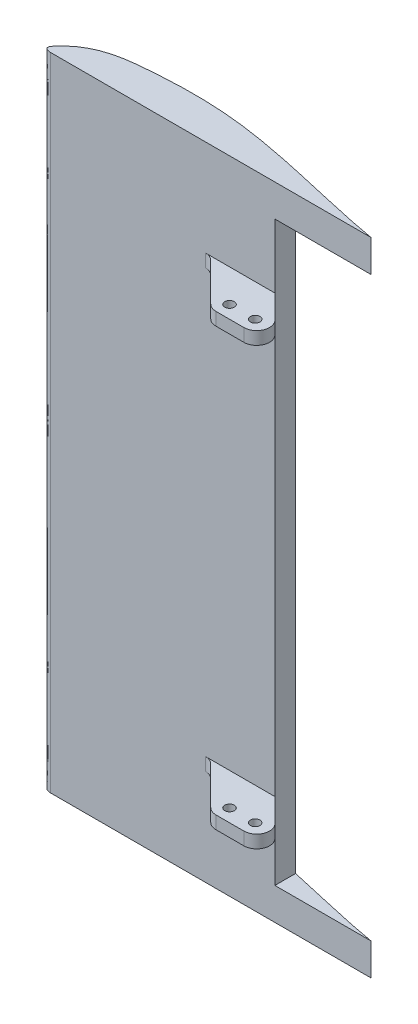
ISO-10303-21;
HEADER;
FILE_DESCRIPTION(('STEP AP214'),'2;1');
FILE_NAME('part.step','',(''),(''),'','','');
FILE_SCHEMA(('AUTOMOTIVE_DESIGN { 1 0 10303 214 1 1 1 1 }'));
ENDSEC;
DATA;
#1=APPLICATION_CONTEXT('core data for automotive mechanical design processes');
#2=APPLICATION_PROTOCOL_DEFINITION('international standard','automotive_design',2000,#1);
#3=PRODUCT_CONTEXT('',#1,'mechanical');
#4=PRODUCT('Part','Part','',(#3));
#5=PRODUCT_RELATED_PRODUCT_CATEGORY('part','',(#4));
#6=PRODUCT_DEFINITION_FORMATION('','',#4);
#7=PRODUCT_DEFINITION_CONTEXT('part definition',#1,'design');
#8=PRODUCT_DEFINITION('design','',#6,#7);
#9=PRODUCT_DEFINITION_SHAPE('','',#8);
#10=(LENGTH_UNIT() NAMED_UNIT(*) SI_UNIT(.MILLI.,.METRE.));
#11=(NAMED_UNIT(*) PLANE_ANGLE_UNIT() SI_UNIT($,.RADIAN.));
#12=(NAMED_UNIT(*) SI_UNIT($,.STERADIAN.) SOLID_ANGLE_UNIT());
#13=UNCERTAINTY_MEASURE_WITH_UNIT(LENGTH_MEASURE(1.E-05),#10,'distance_accuracy_value','');
#14=(GEOMETRIC_REPRESENTATION_CONTEXT(3) GLOBAL_UNCERTAINTY_ASSIGNED_CONTEXT((#13)) GLOBAL_UNIT_ASSIGNED_CONTEXT((#10,
#11,#12)) REPRESENTATION_CONTEXT('',''));
#15=CARTESIAN_POINT('',(0.,0.,0.));
#16=DIRECTION('',(0.,0.,1.));
#17=DIRECTION('',(1.,0.,0.));
#18=AXIS2_PLACEMENT_3D('',#15,#16,#17);
#19=CARTESIAN_POINT('',(-23.8351605851665,100.,0.));
#20=DIRECTION('',(0.,0.,-1.));
#21=DIRECTION('',(-1.,0.,0.));
#22=AXIS2_PLACEMENT_3D('',#19,#20,#21);
#23=PLANE('',#22);
#24=DIRECTION('',(-1.,0.,0.));
#25=VECTOR('',#24,1.);
#26=CARTESIAN_POINT('',(11.1648394148335,83.,0.));
#27=LINE('',#26,#25);
#28=CARTESIAN_POINT('',(11.1648394148335,83.,0.));
#29=VERTEX_POINT('',#28);
#30=CARTESIAN_POINT('',(0.336412290087355,83.,0.));
#31=VERTEX_POINT('',#30);
#32=EDGE_CURVE('E211',#29,#31,#27,.T.);
#33=ORIENTED_EDGE('',*,*,#32,.T.);
#34=DIRECTION('',(0.,-1.,0.));
#35=VECTOR('',#34,1.);
#36=CARTESIAN_POINT('',(0.336412290087355,85.,0.));
#37=LINE('',#36,#35);
#38=CARTESIAN_POINT('',(0.336412290087355,85.,0.));
#39=VERTEX_POINT('',#38);
#40=EDGE_CURVE('E586',#31,#39,#37,.F.);
#41=ORIENTED_EDGE('',*,*,#40,.T.);
#42=DIRECTION('',(-1.,0.,0.));
#43=VECTOR('',#42,1.);
#44=CARTESIAN_POINT('',(11.1648394148335,85.,0.));
#45=LINE('',#44,#43);
#46=CARTESIAN_POINT('',(11.1648394148335,85.,0.));
#47=VERTEX_POINT('',#46);
#48=EDGE_CURVE('E209',#47,#39,#45,.T.);
#49=ORIENTED_EDGE('',*,*,#48,.F.);
#50=DIRECTION('',(0.,1.,0.));
#51=VECTOR('',#50,1.);
#52=CARTESIAN_POINT('',(11.1648394148335,100.,0.));
#53=LINE('',#52,#51);
#54=CARTESIAN_POINT('',(11.1648394148335,95.,0.));
#55=VERTEX_POINT('',#54);
#56=EDGE_CURVE('E199',#47,#55,#53,.T.);
#57=ORIENTED_EDGE('',*,*,#56,.T.);
#58=DIRECTION('',(1.,0.,0.));
#59=VECTOR('',#58,1.);
#60=CARTESIAN_POINT('',(-23.8351605851665,95.,0.));
#61=LINE('',#60,#59);
#62=CARTESIAN_POINT('',(26.1648394148335,95.,0.));
#63=VERTEX_POINT('',#62);
#64=EDGE_CURVE('E243',#55,#63,#61,.T.);
#65=ORIENTED_EDGE('',*,*,#64,.T.);
#66=DIRECTION('',(0.,-1.,0.));
#67=VECTOR('',#66,1.);
#68=CARTESIAN_POINT('',(26.1648394148335,100.,0.));
#69=LINE('',#68,#67);
#70=CARTESIAN_POINT('',(26.1648394148335,100.,0.));
#71=VERTEX_POINT('',#70);
#72=EDGE_CURVE('E522',#71,#63,#69,.T.);
#73=ORIENTED_EDGE('',*,*,#72,.F.);
#74=DIRECTION('',(1.,0.,0.));
#75=VECTOR('',#74,1.);
#76=CARTESIAN_POINT('',(-23.8351605851665,100.,0.));
#77=LINE('',#76,#75);
#78=CARTESIAN_POINT('',(-23.8351605851665,100.,0.));
#79=VERTEX_POINT('',#78);
#80=EDGE_CURVE('E258',#79,#71,#77,.T.);
#81=ORIENTED_EDGE('',*,*,#80,.F.);
#82=DIRECTION('',(0.,-1.,0.));
#83=VECTOR('',#82,1.);
#84=CARTESIAN_POINT('',(-23.8351605851665,100.,0.));
#85=LINE('',#84,#83);
#86=CARTESIAN_POINT('',(-23.8351605851665,0.,0.));
#87=VERTEX_POINT('',#86);
#88=EDGE_CURVE('E525',#79,#87,#85,.T.);
#89=ORIENTED_EDGE('',*,*,#88,.T.);
#90=DIRECTION('',(1.,0.,0.));
#91=VECTOR('',#90,1.);
#92=CARTESIAN_POINT('',(-23.8351605851665,0.,0.));
#93=LINE('',#92,#91);
#94=CARTESIAN_POINT('',(26.1648394148335,0.,0.));
#95=VERTEX_POINT('',#94);
#96=EDGE_CURVE('E507',#87,#95,#93,.T.);
#97=ORIENTED_EDGE('',*,*,#96,.T.);
#98=CARTESIAN_POINT('',(26.1648394148335,5.,0.));
#99=VERTEX_POINT('',#98);
#100=EDGE_CURVE('E521',#99,#95,#69,.T.);
#101=ORIENTED_EDGE('',*,*,#100,.F.);
#102=DIRECTION('',(-1.,0.,0.));
#103=VECTOR('',#102,1.);
#104=CARTESIAN_POINT('',(-23.8351605851665,5.,0.));
#105=LINE('',#104,#103);
#106=CARTESIAN_POINT('',(11.1648394148335,5.,0.));
#107=VERTEX_POINT('',#106);
#108=EDGE_CURVE('E248',#99,#107,#105,.T.);
#109=ORIENTED_EDGE('',*,*,#108,.T.);
#110=CARTESIAN_POINT('',(11.1648394148335,15.,0.));
#111=VERTEX_POINT('',#110);
#112=EDGE_CURVE('E198',#107,#111,#53,.T.);
#113=ORIENTED_EDGE('',*,*,#112,.T.);
#114=DIRECTION('',(-1.,0.,0.));
#115=VECTOR('',#114,1.);
#116=CARTESIAN_POINT('',(11.1648394148335,15.,0.));
#117=LINE('',#116,#115);
#118=CARTESIAN_POINT('',(0.336412290087355,15.,0.));
#119=VERTEX_POINT('',#118);
#120=EDGE_CURVE('E204',#111,#119,#117,.T.);
#121=ORIENTED_EDGE('',*,*,#120,.T.);
#122=DIRECTION('',(0.,1.,0.));
#123=VECTOR('',#122,1.);
#124=CARTESIAN_POINT('',(0.336412290087355,100.,0.));
#125=LINE('',#124,#123);
#126=CARTESIAN_POINT('',(0.336412290087355,17.,0.));
#127=VERTEX_POINT('',#126);
#128=EDGE_CURVE('E203',#119,#127,#125,.T.);
#129=ORIENTED_EDGE('',*,*,#128,.T.);
#130=DIRECTION('',(-1.,0.,0.));
#131=VECTOR('',#130,1.);
#132=CARTESIAN_POINT('',(11.1648394148335,17.,0.));
#133=LINE('',#132,#131);
#134=CARTESIAN_POINT('',(11.1648394148335,17.,0.));
#135=VERTEX_POINT('',#134);
#136=EDGE_CURVE('E176',#135,#127,#133,.T.);
#137=ORIENTED_EDGE('',*,*,#136,.F.);
#138=EDGE_CURVE('E188',#135,#29,#53,.T.);
#139=ORIENTED_EDGE('',*,*,#138,.T.);
#140=EDGE_LOOP('',(#33,#41,#49,#57,#65,#73,#81,#89,#97,#101,#109,#113,#121,#129,#137,#139));
#141=FACE_BOUND('',#140,.T.);
#142=ADVANCED_FACE('F33',(#141),#23,.F.);
#143=CARTESIAN_POINT('',(-24.2675788953221,100.,-1.25622054621105));
#144=CARTESIAN_POINT('',(-25.3670812913603,100.,-0.124338634705401));
#145=CARTESIAN_POINT('',(-23.8351605851665,100.,0.));
#146=B_SPLINE_CURVE_WITH_KNOTS('',2,(#143,#144,#145),.UNSPECIFIED.,.F.,.F.,(3,3),(0.,1.),.UNSPECIFIED.);
#147=DIRECTION('',(0.,-1.,0.));
#148=VECTOR('',#147,1.);
#149=SURFACE_OF_LINEAR_EXTRUSION('',#146,#148);
#150=CARTESIAN_POINT('',(-24.2675788953221,0.,-1.25622054621105));
#151=CARTESIAN_POINT('',(-25.3670812913603,0.,-0.124338634705401));
#152=CARTESIAN_POINT('',(-23.8351605851665,0.,0.));
#153=B_SPLINE_CURVE_WITH_KNOTS('',2,(#150,#151,#152),.UNSPECIFIED.,.F.,.F.,(3,3),(0.,1.),.UNSPECIFIED.);
#154=CARTESIAN_POINT('',(-24.2675788953221,0.,-1.25622054621105));
#155=VERTEX_POINT('',#154);
#156=EDGE_CURVE('E251',#155,#87,#153,.T.);
#157=ORIENTED_EDGE('',*,*,#156,.T.);
#158=ORIENTED_EDGE('',*,*,#88,.F.);
#159=CARTESIAN_POINT('',(-24.2675788953221,100.,-1.25622054621105));
#160=VERTEX_POINT('',#159);
#161=EDGE_CURVE('E252',#160,#79,#146,.T.);
#162=ORIENTED_EDGE('',*,*,#161,.F.);
#163=DIRECTION('',(0.,-1.,0.));
#164=VECTOR('',#163,1.);
#165=CARTESIAN_POINT('',(-24.2675788953221,100.,-1.25622054621105));
#166=LINE('',#165,#164);
#167=EDGE_CURVE('E499',#160,#155,#166,.T.);
#168=ORIENTED_EDGE('',*,*,#167,.T.);
#169=EDGE_LOOP('',(#157,#158,#162,#168));
#170=FACE_BOUND('',#169,.T.);
#171=ADVANCED_FACE('F265',(#170),#149,.F.);
#172=CARTESIAN_POINT('',(26.1648394148335,100.,0.));
#173=CARTESIAN_POINT('',(19.211918985571,100.,-1.16258018784965));
#174=CARTESIAN_POINT('',(4.13271292978012,100.,-5.52501275167282));
#175=CARTESIAN_POINT('',(-8.85012049649564,100.,-5.77485183788265));
#176=CARTESIAN_POINT('',(-18.7383931036189,100.,-4.79326831168846));
#177=CARTESIAN_POINT('',(-22.278212261763,100.,-3.55358612755049));
#178=CARTESIAN_POINT('',(-24.2675788953221,100.,-1.25622054621105));
#179=B_SPLINE_CURVE_WITH_KNOTS('',3,(#172,#173,#174,#175,#176,#177,#178),.UNSPECIFIED.,.F.,.F.,
(4,1,1,1,4),(0.0219972250878111,0.49085189361201,0.815811168310364,0.866725978949163,1.),.UNSPECIFIED.);
#180=DIRECTION('',(0.,-1.,0.));
#181=VECTOR('',#180,1.);
#182=SURFACE_OF_LINEAR_EXTRUSION('',#179,#181);
#183=DIRECTION('',(0.,-1.,0.));
#184=VECTOR('',#183,1.);
#185=CARTESIAN_POINT('',(11.1648394148335,100.,-3.22712026169733));
#186=LINE('',#185,#184);
#187=CARTESIAN_POINT('',(11.1648394148346,95.,-3.22712026169709));
#188=VERTEX_POINT('',#187);
#189=CARTESIAN_POINT('',(11.1648394148335,5.,-3.22712026169733));
#190=VERTEX_POINT('',#189);
#191=EDGE_CURVE('E533',#188,#190,#186,.T.);
#192=ORIENTED_EDGE('',*,*,#191,.T.);
#193=CARTESIAN_POINT('',(26.1648394148335,5.00000000000002,0.));
#194=CARTESIAN_POINT('',(19.211918985571,5.00000000000002,-1.16258018784965));
#195=CARTESIAN_POINT('',(4.13271292978012,5.00000000000002,-5.52501275167282));
#196=CARTESIAN_POINT('',(-8.85012049649564,5.00000000000002,-5.77485183788265));
#197=CARTESIAN_POINT('',(-18.7383931036189,5.00000000000002,-4.79326831168846));
#198=CARTESIAN_POINT('',(-22.278212261763,5.00000000000002,-3.55358612755049));
#199=CARTESIAN_POINT('',(-24.2675788953221,5.00000000000002,-1.25622054621105));
#200=B_SPLINE_CURVE_WITH_KNOTS('',3,(#193,#194,#195,#196,#197,#198,#199),.UNSPECIFIED.,.F.,.F.,
(4,1,1,1,4),(0.0219972250878111,0.49085189361201,0.815811168310364,0.866725978949163,1.),.UNSPECIFIED.);
#201=EDGE_CURVE('E539',#190,#99,#200,.F.);
#202=ORIENTED_EDGE('',*,*,#201,.T.);
#203=ORIENTED_EDGE('',*,*,#100,.T.);
#204=CARTESIAN_POINT('',(26.1648394148335,0.,0.));
#205=CARTESIAN_POINT('',(19.211918985571,0.,-1.16258018784965));
#206=CARTESIAN_POINT('',(4.13271292978012,0.,-5.52501275167282));
#207=CARTESIAN_POINT('',(-8.85012049649564,0.,-5.77485183788265));
#208=CARTESIAN_POINT('',(-18.7383931036189,0.,-4.79326831168846));
#209=CARTESIAN_POINT('',(-22.278212261763,0.,-3.55358612755049));
#210=CARTESIAN_POINT('',(-24.2675788953221,0.,-1.25622054621105));
#211=B_SPLINE_CURVE_WITH_KNOTS('',3,(#204,#205,#206,#207,#208,#209,#210),.UNSPECIFIED.,.F.,.F.,
(4,1,1,1,4),(0.0219972250878111,0.49085189361201,0.815811168310364,0.866725978949163,1.),.UNSPECIFIED.);
#212=EDGE_CURVE('E259',#95,#155,#211,.T.);
#213=ORIENTED_EDGE('',*,*,#212,.T.);
#214=ORIENTED_EDGE('',*,*,#167,.F.);
#215=EDGE_CURVE('E494',#71,#160,#179,.T.);
#216=ORIENTED_EDGE('',*,*,#215,.F.);
#217=ORIENTED_EDGE('',*,*,#72,.T.);
#218=CARTESIAN_POINT('',(26.1648394148335,95.,0.));
#219=CARTESIAN_POINT('',(19.211918985571,95.,-1.16258018784965));
#220=CARTESIAN_POINT('',(4.13271292978012,95.,-5.52501275167282));
#221=CARTESIAN_POINT('',(-8.85012049649564,95.,-5.77485183788265));
#222=CARTESIAN_POINT('',(-18.7383931036189,95.,-4.79326831168846));
#223=CARTESIAN_POINT('',(-22.278212261763,95.,-3.55358612755049));
#224=CARTESIAN_POINT('',(-24.2675788953221,95.,-1.25622054621105));
#225=B_SPLINE_CURVE_WITH_KNOTS('',3,(#218,#219,#220,#221,#222,#223,#224),.UNSPECIFIED.,.F.,.F.,
(4,1,1,1,4),(0.0219972250878111,0.49085189361201,0.815811168310364,0.866725978949163,1.),.UNSPECIFIED.);
#226=EDGE_CURVE('E528',#63,#188,#225,.T.);
#227=ORIENTED_EDGE('',*,*,#226,.T.);
#228=EDGE_LOOP('',(#192,#202,#203,#213,#214,#216,#217,#227));
#229=FACE_BOUND('',#228,.T.);
#230=ADVANCED_FACE('F269',(#229),#182,.F.);
#231=CARTESIAN_POINT('',(-24.7092255158023,100.,-0.376224453905462));
#232=DIRECTION('',(0.,-1.,0.));
#233=DIRECTION('',(0.,0.,-1.));
#234=AXIS2_PLACEMENT_3D('',#231,#232,#233);
#235=PLANE('',#234);
#236=ORIENTED_EDGE('',*,*,#161,.T.);
#237=ORIENTED_EDGE('',*,*,#80,.T.);
#238=ORIENTED_EDGE('',*,*,#215,.T.);
#239=EDGE_LOOP('',(#236,#237,#238));
#240=FACE_BOUND('',#239,.T.);
#241=ADVANCED_FACE('F313',(#240),#235,.F.);
#242=CARTESIAN_POINT('',(-24.7092255158023,0.,-0.376224453905462));
#243=DIRECTION('',(0.,-1.,0.));
#244=DIRECTION('',(0.,0.,-1.));
#245=AXIS2_PLACEMENT_3D('',#242,#243,#244);
#246=PLANE('',#245);
#247=ORIENTED_EDGE('',*,*,#156,.F.);
#248=ORIENTED_EDGE('',*,*,#212,.F.);
#249=ORIENTED_EDGE('',*,*,#96,.F.);
#250=EDGE_LOOP('',(#247,#248,#249));
#251=FACE_BOUND('',#250,.T.);
#252=ADVANCED_FACE('F321',(#251),#246,.T.);
#253=CARTESIAN_POINT('',(26.1648394148335,5.,-90.));
#254=DIRECTION('',(0.,-1.,0.));
#255=DIRECTION('',(0.,0.,-1.));
#256=AXIS2_PLACEMENT_3D('',#253,#254,#255);
#257=PLANE('',#256);
#258=ORIENTED_EDGE('',*,*,#201,.F.);
#259=DIRECTION('',(0.,0.,1.));
#260=VECTOR('',#259,1.);
#261=CARTESIAN_POINT('',(11.1648394148335,5.,-90.));
#262=LINE('',#261,#260);
#263=EDGE_CURVE('E240',#190,#107,#262,.T.);
#264=ORIENTED_EDGE('',*,*,#263,.T.);
#265=ORIENTED_EDGE('',*,*,#108,.F.);
#266=EDGE_LOOP('',(#258,#264,#265));
#267=FACE_BOUND('',#266,.T.);
#268=ADVANCED_FACE('F328',(#267),#257,.F.);
#269=CARTESIAN_POINT('',(11.1648394148335,95.,-90.));
#270=DIRECTION('',(-1.,0.,0.));
#271=DIRECTION('',(0.,-1.,0.));
#272=AXIS2_PLACEMENT_3D('',#269,#270,#271);
#273=PLANE('',#272);
#274=ORIENTED_EDGE('',*,*,#263,.F.);
#275=ORIENTED_EDGE('',*,*,#191,.F.);
#276=DIRECTION('',(0.,0.,1.));
#277=VECTOR('',#276,1.);
#278=CARTESIAN_POINT('',(11.1648394148335,95.,-90.));
#279=LINE('',#278,#277);
#280=EDGE_CURVE('E239',#188,#55,#279,.T.);
#281=ORIENTED_EDGE('',*,*,#280,.T.);
#282=ORIENTED_EDGE('',*,*,#56,.F.);
#283=DIRECTION('',(0.,-1.,0.));
#284=VECTOR('',#283,1.);
#285=CARTESIAN_POINT('',(11.1648394148335,85.,0.));
#286=LINE('',#285,#284);
#287=EDGE_CURVE('E195',#47,#29,#286,.T.);
#288=ORIENTED_EDGE('',*,*,#287,.T.);
#289=ORIENTED_EDGE('',*,*,#138,.F.);
#290=DIRECTION('',(0.,1.,0.));
#291=VECTOR('',#290,1.);
#292=CARTESIAN_POINT('',(11.1648394148335,15.,0.));
#293=LINE('',#292,#291);
#294=EDGE_CURVE('E191',#111,#135,#293,.T.);
#295=ORIENTED_EDGE('',*,*,#294,.F.);
#296=ORIENTED_EDGE('',*,*,#112,.F.);
#297=EDGE_LOOP('',(#274,#275,#281,#282,#288,#289,#295,#296));
#298=FACE_BOUND('',#297,.T.);
#299=ADVANCED_FACE('F190',(#298),#273,.F.);
#300=CARTESIAN_POINT('',(26.1648394148335,95.,-90.));
#301=DIRECTION('',(0.,1.,0.));
#302=DIRECTION('',(0.,0.,1.));
#303=AXIS2_PLACEMENT_3D('',#300,#301,#302);
#304=PLANE('',#303);
#305=ORIENTED_EDGE('',*,*,#280,.F.);
#306=ORIENTED_EDGE('',*,*,#226,.F.);
#307=ORIENTED_EDGE('',*,*,#64,.F.);
#308=EDGE_LOOP('',(#305,#306,#307));
#309=FACE_BOUND('',#308,.T.);
#310=ADVANCED_FACE('F343',(#309),#304,.F.);
#311=CARTESIAN_POINT('',(18.2359072266991,85.,7.07106781186544));
#312=DIRECTION('',(0.,-1.,0.));
#313=DIRECTION('',(0.,0.,-1.));
#314=AXIS2_PLACEMENT_3D('',#311,#312,#313);
#315=PLANE('',#314);
#316=CARTESIAN_POINT('',(13.1648394148335,85.,5.07106781186544));
#317=DIRECTION('',(0.,1.,0.));
#318=DIRECTION('',(0.,0.,1.));
#319=AXIS2_PLACEMENT_3D('',#316,#317,#318);
#320=CIRCLE('',#319,0.75);
#321=CARTESIAN_POINT('',(13.1648394148335,85.,5.82106781186544));
#322=VERTEX_POINT('',#321);
#323=EDGE_CURVE('E656',#322,#322,#320,.T.);
#324=ORIENTED_EDGE('',*,*,#323,.F.);
#325=EDGE_LOOP('',(#324));
#326=FACE_BOUND('',#325,.T.);
#327=CARTESIAN_POINT('',(9.16483941483353,85.,5.07106781186544));
#328=DIRECTION('',(0.,1.,0.));
#329=DIRECTION('',(0.,0.,1.));
#330=AXIS2_PLACEMENT_3D('',#327,#328,#329);
#331=CIRCLE('',#330,0.75);
#332=CARTESIAN_POINT('',(9.16483941483353,85.,5.82106781186544));
#333=VERTEX_POINT('',#332);
#334=EDGE_CURVE('E598',#333,#333,#331,.T.);
#335=ORIENTED_EDGE('',*,*,#334,.F.);
#336=EDGE_LOOP('',(#335));
#337=FACE_BOUND('',#336,.T.);
#338=DIRECTION('',(-1.,0.,0.));
#339=VECTOR('',#338,1.);
#340=CARTESIAN_POINT('',(18.2359072266991,85.,7.07106781186544));
#341=LINE('',#340,#339);
#342=CARTESIAN_POINT('',(13.4074801019528,85.,7.07106781186544));
#343=VERTEX_POINT('',#342);
#344=CARTESIAN_POINT('',(9.06433435144524,85.,7.07106781186544));
#345=VERTEX_POINT('',#344);
#346=EDGE_CURVE('E221',#343,#345,#341,.T.);
#347=ORIENTED_EDGE('',*,*,#346,.F.);
#348=CARTESIAN_POINT('',(13.4074801019528,85.,5.07106781186544));
#349=DIRECTION('',(0.,-1.,0.));
#350=DIRECTION('',(0.,0.,-1.));
#351=AXIS2_PLACEMENT_3D('',#348,#349,#350);
#352=CIRCLE('',#351,2.);
#353=CARTESIAN_POINT('',(14.8216936643259,85.,3.65685424949234));
#354=VERTEX_POINT('',#353);
#355=EDGE_CURVE('E561',#343,#354,#352,.F.);
#356=ORIENTED_EDGE('',*,*,#355,.T.);
#357=DIRECTION('',(-0.707106781186551,0.,-0.707106781186544));
#358=VECTOR('',#357,1.);
#359=CARTESIAN_POINT('',(18.2359072266991,85.,7.07106781186544));
#360=LINE('',#359,#358);
#361=EDGE_CURVE('E226',#354,#47,#360,.T.);
#362=ORIENTED_EDGE('',*,*,#361,.T.);
#363=ORIENTED_EDGE('',*,*,#48,.T.);
#364=CARTESIAN_POINT('',(0.336412290087355,85.,2.));
#365=DIRECTION('',(0.,-1.,0.));
#366=DIRECTION('',(0.,0.,-1.));
#367=AXIS2_PLACEMENT_3D('',#364,#365,#366);
#368=CIRCLE('',#367,2.);
#369=CARTESIAN_POINT('',(1.75062585246044,85.,0.585786437626895));
#370=VERTEX_POINT('',#369);
#371=EDGE_CURVE('E593',#39,#370,#368,.T.);
#372=ORIENTED_EDGE('',*,*,#371,.T.);
#373=DIRECTION('',(-0.707106781186551,0.,-0.707106781186544));
#374=VECTOR('',#373,1.);
#375=CARTESIAN_POINT('',(8.23590722669905,85.,7.07106781186544));
#376=LINE('',#375,#374);
#377=CARTESIAN_POINT('',(7.65012078907215,85.,6.48528137423854));
#378=VERTEX_POINT('',#377);
#379=EDGE_CURVE('E236',#378,#370,#376,.T.);
#380=ORIENTED_EDGE('',*,*,#379,.F.);
#381=CARTESIAN_POINT('',(9.06433435144524,85.,5.07106781186544));
#382=DIRECTION('',(0.,-1.,0.));
#383=DIRECTION('',(0.,0.,-1.));
#384=AXIS2_PLACEMENT_3D('',#381,#382,#383);
#385=CIRCLE('',#384,2.);
#386=EDGE_CURVE('E559',#378,#345,#385,.F.);
#387=ORIENTED_EDGE('',*,*,#386,.T.);
#388=EDGE_LOOP('',(#347,#356,#362,#363,#372,#380,#387));
#389=FACE_BOUND('',#388,.T.);
#390=ADVANCED_FACE('F350',(#326,#337,#389),#315,.F.);
#391=CARTESIAN_POINT('',(8.23590722669905,85.,7.07106781186544));
#392=DIRECTION('',(0.707106781186544,0.,-0.707106781186551));
#393=DIRECTION('',(-0.707106781186551,0.,-0.707106781186544));
#394=AXIS2_PLACEMENT_3D('',#391,#392,#393);
#395=PLANE('',#394);
#396=ORIENTED_EDGE('',*,*,#379,.T.);
#397=DIRECTION('',(0.,-1.,0.));
#398=VECTOR('',#397,1.);
#399=CARTESIAN_POINT('',(1.75062585246044,83.,0.585786437626897));
#400=LINE('',#399,#398);
#401=CARTESIAN_POINT('',(1.75062585246044,83.,0.585786437626895));
#402=VERTEX_POINT('',#401);
#403=EDGE_CURVE('E582',#370,#402,#400,.T.);
#404=ORIENTED_EDGE('',*,*,#403,.T.);
#405=DIRECTION('',(-0.707106781186551,0.,-0.707106781186544));
#406=VECTOR('',#405,1.);
#407=CARTESIAN_POINT('',(8.23590722669905,83.,7.07106781186544));
#408=LINE('',#407,#406);
#409=CARTESIAN_POINT('',(7.65012078907215,83.,6.48528137423854));
#410=VERTEX_POINT('',#409);
#411=EDGE_CURVE('E233',#410,#402,#408,.T.);
#412=ORIENTED_EDGE('',*,*,#411,.F.);
#413=DIRECTION('',(0.,-1.,0.));
#414=VECTOR('',#413,1.);
#415=CARTESIAN_POINT('',(7.65012078907215,85.,6.48528137423854));
#416=LINE('',#415,#414);
#417=EDGE_CURVE('E563',#410,#378,#416,.F.);
#418=ORIENTED_EDGE('',*,*,#417,.T.);
#419=EDGE_LOOP('',(#396,#404,#412,#418));
#420=FACE_BOUND('',#419,.T.);
#421=ADVANCED_FACE('F358',(#420),#395,.F.);
#422=CARTESIAN_POINT('',(18.2359072266991,83.,7.07106781186544));
#423=DIRECTION('',(0.,-1.,0.));
#424=DIRECTION('',(0.,0.,-1.));
#425=AXIS2_PLACEMENT_3D('',#422,#423,#424);
#426=PLANE('',#425);
#427=CARTESIAN_POINT('',(13.1648394148335,83.,5.07106781186544));
#428=DIRECTION('',(0.,-1.,0.));
#429=DIRECTION('',(0.,0.,-1.));
#430=AXIS2_PLACEMENT_3D('',#427,#428,#429);
#431=CIRCLE('',#430,0.75);
#432=CARTESIAN_POINT('',(13.1648394148335,83.,4.32106781186544));
#433=VERTEX_POINT('',#432);
#434=EDGE_CURVE('E603',#433,#433,#431,.T.);
#435=ORIENTED_EDGE('',*,*,#434,.F.);
#436=EDGE_LOOP('',(#435));
#437=FACE_BOUND('',#436,.T.);
#438=CARTESIAN_POINT('',(9.16483941483353,83.,5.07106781186544));
#439=DIRECTION('',(0.,-1.,0.));
#440=DIRECTION('',(0.,0.,-1.));
#441=AXIS2_PLACEMENT_3D('',#438,#439,#440);
#442=CIRCLE('',#441,0.75);
#443=CARTESIAN_POINT('',(9.16483941483353,83.,4.32106781186544));
#444=VERTEX_POINT('',#443);
#445=EDGE_CURVE('E182',#444,#444,#442,.T.);
#446=ORIENTED_EDGE('',*,*,#445,.F.);
#447=EDGE_LOOP('',(#446));
#448=FACE_BOUND('',#447,.T.);
#449=DIRECTION('',(-0.707106781186551,0.,-0.707106781186544));
#450=VECTOR('',#449,1.);
#451=CARTESIAN_POINT('',(18.2359072266991,83.,7.07106781186544));
#452=LINE('',#451,#450);
#453=CARTESIAN_POINT('',(14.8216936643259,83.,3.65685424949234));
#454=VERTEX_POINT('',#453);
#455=EDGE_CURVE('E231',#454,#29,#452,.T.);
#456=ORIENTED_EDGE('',*,*,#455,.F.);
#457=CARTESIAN_POINT('',(13.4074801019528,83.,5.07106781186544));
#458=DIRECTION('',(0.,-1.,0.));
#459=DIRECTION('',(0.,0.,-1.));
#460=AXIS2_PLACEMENT_3D('',#457,#458,#459);
#461=CIRCLE('',#460,2.);
#462=CARTESIAN_POINT('',(13.4074801019528,83.,7.07106781186544));
#463=VERTEX_POINT('',#462);
#464=EDGE_CURVE('E552',#454,#463,#461,.T.);
#465=ORIENTED_EDGE('',*,*,#464,.T.);
#466=DIRECTION('',(-1.,0.,0.));
#467=VECTOR('',#466,1.);
#468=CARTESIAN_POINT('',(18.2359072266991,83.,7.07106781186544));
#469=LINE('',#468,#467);
#470=CARTESIAN_POINT('',(9.06433435144524,83.,7.07106781186544));
#471=VERTEX_POINT('',#470);
#472=EDGE_CURVE('E224',#463,#471,#469,.T.);
#473=ORIENTED_EDGE('',*,*,#472,.T.);
#474=CARTESIAN_POINT('',(9.06433435144524,83.,5.07106781186544));
#475=DIRECTION('',(0.,-1.,0.));
#476=DIRECTION('',(0.,0.,-1.));
#477=AXIS2_PLACEMENT_3D('',#474,#475,#476);
#478=CIRCLE('',#477,2.);
#479=EDGE_CURVE('E550',#471,#410,#478,.T.);
#480=ORIENTED_EDGE('',*,*,#479,.T.);
#481=ORIENTED_EDGE('',*,*,#411,.T.);
#482=CARTESIAN_POINT('',(0.336412290087355,83.,2.));
#483=DIRECTION('',(0.,-1.,0.));
#484=DIRECTION('',(0.,0.,-1.));
#485=AXIS2_PLACEMENT_3D('',#482,#483,#484);
#486=CIRCLE('',#485,2.);
#487=EDGE_CURVE('E590',#402,#31,#486,.F.);
#488=ORIENTED_EDGE('',*,*,#487,.T.);
#489=ORIENTED_EDGE('',*,*,#32,.F.);
#490=EDGE_LOOP('',(#456,#465,#473,#480,#481,#488,#489));
#491=FACE_BOUND('',#490,.T.);
#492=ADVANCED_FACE('F367',(#437,#448,#491),#426,.T.);
#493=CARTESIAN_POINT('',(18.2359072266991,85.,7.07106781186544));
#494=DIRECTION('',(0.707106781186544,0.,-0.707106781186551));
#495=DIRECTION('',(-0.707106781186551,0.,-0.707106781186544));
#496=AXIS2_PLACEMENT_3D('',#493,#494,#495);
#497=PLANE('',#496);
#498=ORIENTED_EDGE('',*,*,#361,.F.);
#499=DIRECTION('',(0.,-1.,0.));
#500=VECTOR('',#499,1.);
#501=CARTESIAN_POINT('',(14.8216936643259,85.,3.65685424949234));
#502=LINE('',#501,#500);
#503=EDGE_CURVE('E544',#354,#454,#502,.T.);
#504=ORIENTED_EDGE('',*,*,#503,.T.);
#505=ORIENTED_EDGE('',*,*,#455,.T.);
#506=ORIENTED_EDGE('',*,*,#287,.F.);
#507=EDGE_LOOP('',(#498,#504,#505,#506));
#508=FACE_BOUND('',#507,.T.);
#509=ADVANCED_FACE('F375',(#508),#497,.T.);
#510=CARTESIAN_POINT('',(7.07106781186551,0.,7.07106781186544));
#511=DIRECTION('',(0.,0.,1.));
#512=DIRECTION('',(1.,0.,0.));
#513=AXIS2_PLACEMENT_3D('',#510,#511,#512);
#514=PLANE('',#513);
#515=ORIENTED_EDGE('',*,*,#472,.F.);
#516=DIRECTION('',(0.,-1.,0.));
#517=VECTOR('',#516,1.);
#518=CARTESIAN_POINT('',(13.4074801019528,0.,7.07106781186544));
#519=LINE('',#518,#517);
#520=EDGE_CURVE('E557',#463,#343,#519,.F.);
#521=ORIENTED_EDGE('',*,*,#520,.T.);
#522=ORIENTED_EDGE('',*,*,#346,.T.);
#523=DIRECTION('',(0.,-1.,0.));
#524=VECTOR('',#523,1.);
#525=CARTESIAN_POINT('',(9.06433435144524,83.,7.07106781186544));
#526=LINE('',#525,#524);
#527=EDGE_CURVE('E554',#345,#471,#526,.T.);
#528=ORIENTED_EDGE('',*,*,#527,.T.);
#529=EDGE_LOOP('',(#515,#521,#522,#528));
#530=FACE_BOUND('',#529,.T.);
#531=ADVANCED_FACE('F383',(#530),#514,.T.);
#532=CARTESIAN_POINT('',(18.2359072266991,15.,7.07106781186544));
#533=DIRECTION('',(-0.707106781186544,0.,0.707106781186551));
#534=DIRECTION('',(0.707106781186551,0.,0.707106781186544));
#535=AXIS2_PLACEMENT_3D('',#532,#533,#534);
#536=PLANE('',#535);
#537=DIRECTION('',(-0.707106781186551,0.,-0.707106781186544));
#538=VECTOR('',#537,1.);
#539=CARTESIAN_POINT('',(18.2359072266991,17.,7.07106781186544));
#540=LINE('',#539,#538);
#541=CARTESIAN_POINT('',(14.8216936643259,17.,3.65685424949234));
#542=VERTEX_POINT('',#541);
#543=EDGE_CURVE('E171',#542,#135,#540,.T.);
#544=ORIENTED_EDGE('',*,*,#543,.F.);
#545=DIRECTION('',(0.,1.,0.));
#546=VECTOR('',#545,1.);
#547=CARTESIAN_POINT('',(14.8216936643259,15.,3.65685424949234));
#548=LINE('',#547,#546);
#549=CARTESIAN_POINT('',(14.8216936643259,15.,3.65685424949234));
#550=VERTEX_POINT('',#549);
#551=EDGE_CURVE('E573',#542,#550,#548,.F.);
#552=ORIENTED_EDGE('',*,*,#551,.T.);
#553=DIRECTION('',(-0.707106781186551,0.,-0.707106781186544));
#554=VECTOR('',#553,1.);
#555=CARTESIAN_POINT('',(18.2359072266991,15.,7.07106781186544));
#556=LINE('',#555,#554);
#557=EDGE_CURVE('E208',#550,#111,#556,.T.);
#558=ORIENTED_EDGE('',*,*,#557,.T.);
#559=ORIENTED_EDGE('',*,*,#294,.T.);
#560=EDGE_LOOP('',(#544,#552,#558,#559));
#561=FACE_BOUND('',#560,.T.);
#562=ADVANCED_FACE('F206',(#561),#536,.F.);
#563=CARTESIAN_POINT('',(18.2359072266991,17.,7.07106781186544));
#564=DIRECTION('',(0.,-1.,0.));
#565=DIRECTION('',(0.,0.,-1.));
#566=AXIS2_PLACEMENT_3D('',#563,#564,#565);
#567=PLANE('',#566);
#568=CARTESIAN_POINT('',(13.1648394148335,17.,5.07106781186544));
#569=DIRECTION('',(0.,-1.,0.));
#570=DIRECTION('',(0.,0.,-1.));
#571=AXIS2_PLACEMENT_3D('',#568,#569,#570);
#572=CIRCLE('',#571,0.75);
#573=CARTESIAN_POINT('',(13.1648394148335,17.,4.32106781186544));
#574=VERTEX_POINT('',#573);
#575=EDGE_CURVE('E607',#574,#574,#572,.T.);
#576=ORIENTED_EDGE('',*,*,#575,.T.);
#577=EDGE_LOOP('',(#576));
#578=FACE_BOUND('',#577,.T.);
#579=CARTESIAN_POINT('',(9.16483941483353,17.,5.07106781186544));
#580=DIRECTION('',(0.,-1.,0.));
#581=DIRECTION('',(0.,0.,-1.));
#582=AXIS2_PLACEMENT_3D('',#579,#580,#581);
#583=CIRCLE('',#582,0.75);
#584=CARTESIAN_POINT('',(9.16483941483353,17.,4.32106781186544));
#585=VERTEX_POINT('',#584);
#586=EDGE_CURVE('E597',#585,#585,#583,.T.);
#587=ORIENTED_EDGE('',*,*,#586,.T.);
#588=EDGE_LOOP('',(#587));
#589=FACE_BOUND('',#588,.T.);
#590=DIRECTION('',(-1.,0.,0.));
#591=VECTOR('',#590,1.);
#592=CARTESIAN_POINT('',(18.2359072266991,17.,7.07106781186544));
#593=LINE('',#592,#591);
#594=CARTESIAN_POINT('',(13.4074801019528,17.,7.07106781186544));
#595=VERTEX_POINT('',#594);
#596=CARTESIAN_POINT('',(9.06433435144524,17.,7.07106781186544));
#597=VERTEX_POINT('',#596);
#598=EDGE_CURVE('E218',#595,#597,#593,.T.);
#599=ORIENTED_EDGE('',*,*,#598,.F.);
#600=CARTESIAN_POINT('',(13.4074801019528,17.,5.07106781186544));
#601=DIRECTION('',(0.,-1.,0.));
#602=DIRECTION('',(0.,0.,-1.));
#603=AXIS2_PLACEMENT_3D('',#600,#601,#602);
#604=CIRCLE('',#603,2.);
#605=EDGE_CURVE('E177',#595,#542,#604,.F.);
#606=ORIENTED_EDGE('',*,*,#605,.T.);
#607=ORIENTED_EDGE('',*,*,#543,.T.);
#608=ORIENTED_EDGE('',*,*,#136,.T.);
#609=CARTESIAN_POINT('',(0.336412290087355,17.,2.));
#610=DIRECTION('',(0.,-1.,0.));
#611=DIRECTION('',(0.,0.,-1.));
#612=AXIS2_PLACEMENT_3D('',#609,#610,#611);
#613=CIRCLE('',#612,2.);
#614=CARTESIAN_POINT('',(1.75062585246044,17.,0.585786437626896));
#615=VERTEX_POINT('',#614);
#616=EDGE_CURVE('E42',#127,#615,#613,.T.);
#617=ORIENTED_EDGE('',*,*,#616,.T.);
#618=DIRECTION('',(-0.707106781186551,0.,-0.707106781186544));
#619=VECTOR('',#618,1.);
#620=CARTESIAN_POINT('',(8.23590722669905,17.,7.07106781186544));
#621=LINE('',#620,#619);
#622=CARTESIAN_POINT('',(7.65012078907215,17.,6.48528137423854));
#623=VERTEX_POINT('',#622);
#624=EDGE_CURVE('E181',#623,#615,#621,.T.);
#625=ORIENTED_EDGE('',*,*,#624,.F.);
#626=CARTESIAN_POINT('',(9.06433435144524,17.,5.07106781186544));
#627=DIRECTION('',(0.,-1.,0.));
#628=DIRECTION('',(0.,0.,-1.));
#629=AXIS2_PLACEMENT_3D('',#626,#627,#628);
#630=CIRCLE('',#629,2.);
#631=EDGE_CURVE('E570',#623,#597,#630,.F.);
#632=ORIENTED_EDGE('',*,*,#631,.T.);
#633=EDGE_LOOP('',(#599,#606,#607,#608,#617,#625,#632));
#634=FACE_BOUND('',#633,.T.);
#635=ADVANCED_FACE('F174',(#578,#589,#634),#567,.F.);
#636=CARTESIAN_POINT('',(8.23590722669905,15.,7.07106781186544));
#637=DIRECTION('',(-0.707106781186544,0.,0.707106781186551));
#638=DIRECTION('',(0.707106781186551,0.,0.707106781186544));
#639=AXIS2_PLACEMENT_3D('',#636,#637,#638);
#640=PLANE('',#639);
#641=ORIENTED_EDGE('',*,*,#624,.T.);
#642=DIRECTION('',(0.,1.,0.));
#643=VECTOR('',#642,1.);
#644=CARTESIAN_POINT('',(1.75062585246044,15.,0.585786437626898));
#645=LINE('',#644,#643);
#646=CARTESIAN_POINT('',(1.75062585246044,15.,0.585786437626896));
#647=VERTEX_POINT('',#646);
#648=EDGE_CURVE('E56',#615,#647,#645,.F.);
#649=ORIENTED_EDGE('',*,*,#648,.T.);
#650=DIRECTION('',(-0.707106781186551,0.,-0.707106781186544));
#651=VECTOR('',#650,1.);
#652=CARTESIAN_POINT('',(8.23590722669905,15.,7.07106781186544));
#653=LINE('',#652,#651);
#654=CARTESIAN_POINT('',(7.65012078907215,15.,6.48528137423854));
#655=VERTEX_POINT('',#654);
#656=EDGE_CURVE('E614',#655,#647,#653,.T.);
#657=ORIENTED_EDGE('',*,*,#656,.F.);
#658=DIRECTION('',(0.,1.,0.));
#659=VECTOR('',#658,1.);
#660=CARTESIAN_POINT('',(7.65012078907215,15.,6.48528137423854));
#661=LINE('',#660,#659);
#662=EDGE_CURVE('E579',#655,#623,#661,.T.);
#663=ORIENTED_EDGE('',*,*,#662,.T.);
#664=EDGE_LOOP('',(#641,#649,#657,#663));
#665=FACE_BOUND('',#664,.T.);
#666=ADVANCED_FACE('F404',(#665),#640,.T.);
#667=CARTESIAN_POINT('',(18.2359072266991,15.,7.07106781186544));
#668=DIRECTION('',(0.,-1.,0.));
#669=DIRECTION('',(0.,0.,-1.));
#670=AXIS2_PLACEMENT_3D('',#667,#668,#669);
#671=PLANE('',#670);
#672=CARTESIAN_POINT('',(13.1648394148335,15.,5.07106781186544));
#673=DIRECTION('',(0.,-1.,0.));
#674=DIRECTION('',(0.,0.,-1.));
#675=AXIS2_PLACEMENT_3D('',#672,#673,#674);
#676=CIRCLE('',#675,0.75);
#677=CARTESIAN_POINT('',(13.1648394148335,15.,4.32106781186544));
#678=VERTEX_POINT('',#677);
#679=EDGE_CURVE('E37',#678,#678,#676,.T.);
#680=ORIENTED_EDGE('',*,*,#679,.F.);
#681=EDGE_LOOP('',(#680));
#682=FACE_BOUND('',#681,.T.);
#683=CARTESIAN_POINT('',(9.16483941483353,15.,5.07106781186544));
#684=DIRECTION('',(0.,-1.,0.));
#685=DIRECTION('',(0.,0.,-1.));
#686=AXIS2_PLACEMENT_3D('',#683,#684,#685);
#687=CIRCLE('',#686,0.75);
#688=CARTESIAN_POINT('',(9.16483941483353,15.,4.32106781186544));
#689=VERTEX_POINT('',#688);
#690=EDGE_CURVE('E595',#689,#689,#687,.T.);
#691=ORIENTED_EDGE('',*,*,#690,.F.);
#692=EDGE_LOOP('',(#691));
#693=FACE_BOUND('',#692,.T.);
#694=ORIENTED_EDGE('',*,*,#557,.F.);
#695=CARTESIAN_POINT('',(13.4074801019528,15.,5.07106781186544));
#696=DIRECTION('',(0.,-1.,0.));
#697=DIRECTION('',(0.,0.,-1.));
#698=AXIS2_PLACEMENT_3D('',#695,#696,#697);
#699=CIRCLE('',#698,2.);
#700=CARTESIAN_POINT('',(13.4074801019528,15.,7.07106781186544));
#701=VERTEX_POINT('',#700);
#702=EDGE_CURVE('E577',#550,#701,#699,.T.);
#703=ORIENTED_EDGE('',*,*,#702,.T.);
#704=DIRECTION('',(-1.,0.,0.));
#705=VECTOR('',#704,1.);
#706=CARTESIAN_POINT('',(18.2359072266991,15.,7.07106781186544));
#707=LINE('',#706,#705);
#708=CARTESIAN_POINT('',(9.06433435144524,15.,7.07106781186544));
#709=VERTEX_POINT('',#708);
#710=EDGE_CURVE('E215',#701,#709,#707,.T.);
#711=ORIENTED_EDGE('',*,*,#710,.T.);
#712=CARTESIAN_POINT('',(9.06433435144524,15.,5.07106781186544));
#713=DIRECTION('',(0.,-1.,0.));
#714=DIRECTION('',(0.,0.,-1.));
#715=AXIS2_PLACEMENT_3D('',#712,#713,#714);
#716=CIRCLE('',#715,2.);
#717=EDGE_CURVE('E575',#709,#655,#716,.T.);
#718=ORIENTED_EDGE('',*,*,#717,.T.);
#719=ORIENTED_EDGE('',*,*,#656,.T.);
#720=CARTESIAN_POINT('',(0.336412290087355,15.,2.));
#721=DIRECTION('',(0.,-1.,0.));
#722=DIRECTION('',(0.,0.,-1.));
#723=AXIS2_PLACEMENT_3D('',#720,#721,#722);
#724=CIRCLE('',#723,2.);
#725=EDGE_CURVE('E11',#647,#119,#724,.F.);
#726=ORIENTED_EDGE('',*,*,#725,.T.);
#727=ORIENTED_EDGE('',*,*,#120,.F.);
#728=EDGE_LOOP('',(#694,#703,#711,#718,#719,#726,#727));
#729=FACE_BOUND('',#728,.T.);
#730=ADVANCED_FACE('F412',(#682,#693,#729),#671,.T.);
#731=CARTESIAN_POINT('',(7.07106781186551,0.,7.07106781186544));
#732=DIRECTION('',(0.,0.,1.));
#733=DIRECTION('',(1.,0.,0.));
#734=AXIS2_PLACEMENT_3D('',#731,#732,#733);
#735=PLANE('',#734);
#736=ORIENTED_EDGE('',*,*,#710,.F.);
#737=DIRECTION('',(0.,1.,0.));
#738=VECTOR('',#737,1.);
#739=CARTESIAN_POINT('',(13.4074801019528,17.,7.07106781186544));
#740=LINE('',#739,#738);
#741=EDGE_CURVE('E567',#701,#595,#740,.T.);
#742=ORIENTED_EDGE('',*,*,#741,.T.);
#743=ORIENTED_EDGE('',*,*,#598,.T.);
#744=DIRECTION('',(0.,1.,0.));
#745=VECTOR('',#744,1.);
#746=CARTESIAN_POINT('',(9.06433435144524,0.,7.07106781186544));
#747=LINE('',#746,#745);
#748=EDGE_CURVE('E565',#597,#709,#747,.F.);
#749=ORIENTED_EDGE('',*,*,#748,.T.);
#750=EDGE_LOOP('',(#736,#742,#743,#749));
#751=FACE_BOUND('',#750,.T.);
#752=ADVANCED_FACE('F276',(#751),#735,.T.);
#753=CARTESIAN_POINT('',(13.4074801019528,85.,5.07106781186544));
#754=DIRECTION('',(0.,-1.,0.));
#755=DIRECTION('',(0.,0.,-1.));
#756=AXIS2_PLACEMENT_3D('',#753,#754,#755);
#757=CYLINDRICAL_SURFACE('',#756,2.);
#758=ORIENTED_EDGE('',*,*,#355,.F.);
#759=ORIENTED_EDGE('',*,*,#520,.F.);
#760=ORIENTED_EDGE('',*,*,#464,.F.);
#761=ORIENTED_EDGE('',*,*,#503,.F.);
#762=EDGE_LOOP('',(#758,#759,#760,#761));
#763=FACE_BOUND('',#762,.T.);
#764=ADVANCED_FACE('F272',(#763),#757,.T.);
#765=CARTESIAN_POINT('',(9.06433435144524,0.,5.07106781186544));
#766=DIRECTION('',(0.,1.,0.));
#767=DIRECTION('',(0.,0.,1.));
#768=AXIS2_PLACEMENT_3D('',#765,#766,#767);
#769=CYLINDRICAL_SURFACE('',#768,2.);
#770=ORIENTED_EDGE('',*,*,#386,.F.);
#771=ORIENTED_EDGE('',*,*,#417,.F.);
#772=ORIENTED_EDGE('',*,*,#479,.F.);
#773=ORIENTED_EDGE('',*,*,#527,.F.);
#774=EDGE_LOOP('',(#770,#771,#772,#773));
#775=FACE_BOUND('',#774,.T.);
#776=ADVANCED_FACE('F275',(#775),#769,.T.);
#777=CARTESIAN_POINT('',(13.4074801019528,0.,5.07106781186544));
#778=DIRECTION('',(0.,-1.,0.));
#779=DIRECTION('',(0.,0.,-1.));
#780=AXIS2_PLACEMENT_3D('',#777,#778,#779);
#781=CYLINDRICAL_SURFACE('',#780,2.);
#782=ORIENTED_EDGE('',*,*,#702,.F.);
#783=ORIENTED_EDGE('',*,*,#551,.F.);
#784=ORIENTED_EDGE('',*,*,#605,.F.);
#785=ORIENTED_EDGE('',*,*,#741,.F.);
#786=EDGE_LOOP('',(#782,#783,#784,#785));
#787=FACE_BOUND('',#786,.T.);
#788=ADVANCED_FACE('F280',(#787),#781,.T.);
#789=CARTESIAN_POINT('',(9.06433435144524,15.,5.07106781186544));
#790=DIRECTION('',(0.,1.,0.));
#791=DIRECTION('',(0.,0.,1.));
#792=AXIS2_PLACEMENT_3D('',#789,#790,#791);
#793=CYLINDRICAL_SURFACE('',#792,2.);
#794=ORIENTED_EDGE('',*,*,#717,.F.);
#795=ORIENTED_EDGE('',*,*,#748,.F.);
#796=ORIENTED_EDGE('',*,*,#631,.F.);
#797=ORIENTED_EDGE('',*,*,#662,.F.);
#798=EDGE_LOOP('',(#794,#795,#796,#797));
#799=FACE_BOUND('',#798,.T.);
#800=ADVANCED_FACE('F284',(#799),#793,.T.);
#801=CARTESIAN_POINT('',(0.336412290087355,85.,2.));
#802=DIRECTION('',(0.,1.,0.));
#803=DIRECTION('',(0.,0.,1.));
#804=AXIS2_PLACEMENT_3D('',#801,#802,#803);
#805=CYLINDRICAL_SURFACE('',#804,2.);
#806=ORIENTED_EDGE('',*,*,#371,.F.);
#807=ORIENTED_EDGE('',*,*,#40,.F.);
#808=ORIENTED_EDGE('',*,*,#487,.F.);
#809=ORIENTED_EDGE('',*,*,#403,.F.);
#810=EDGE_LOOP('',(#806,#807,#808,#809));
#811=FACE_BOUND('',#810,.T.);
#812=ADVANCED_FACE('F287',(#811),#805,.F.);
#813=CARTESIAN_POINT('',(0.336412290087355,100.,2.));
#814=DIRECTION('',(0.,1.,0.));
#815=DIRECTION('',(0.,0.,1.));
#816=AXIS2_PLACEMENT_3D('',#813,#814,#815);
#817=CYLINDRICAL_SURFACE('',#816,2.);
#818=ORIENTED_EDGE('',*,*,#725,.F.);
#819=ORIENTED_EDGE('',*,*,#648,.F.);
#820=ORIENTED_EDGE('',*,*,#616,.F.);
#821=ORIENTED_EDGE('',*,*,#128,.F.);
#822=EDGE_LOOP('',(#818,#819,#820,#821));
#823=FACE_BOUND('',#822,.T.);
#824=ADVANCED_FACE('F35',(#823),#817,.F.);
#825=CARTESIAN_POINT('',(9.16483941483353,-25.,5.07106781186544));
#826=DIRECTION('',(0.,1.,0.));
#827=DIRECTION('',(0.,0.,1.));
#828=AXIS2_PLACEMENT_3D('',#825,#826,#827);
#829=CYLINDRICAL_SURFACE('',#828,0.75);
#830=ORIENTED_EDGE('',*,*,#690,.T.);
#831=EDGE_LOOP('',(#830));
#832=FACE_BOUND('',#831,.T.);
#833=ORIENTED_EDGE('',*,*,#586,.F.);
#834=EDGE_LOOP('',(#833));
#835=FACE_BOUND('',#834,.T.);
#836=ADVANCED_FACE('F294',(#832,#835),#829,.F.);
#837=ORIENTED_EDGE('',*,*,#445,.T.);
#838=EDGE_LOOP('',(#837));
#839=FACE_BOUND('',#838,.T.);
#840=ORIENTED_EDGE('',*,*,#334,.T.);
#841=EDGE_LOOP('',(#840));
#842=FACE_BOUND('',#841,.T.);
#843=ADVANCED_FACE('F460',(#839,#842),#829,.F.);
#844=CARTESIAN_POINT('',(13.1648394148335,-25.,5.07106781186544));
#845=DIRECTION('',(0.,1.,0.));
#846=DIRECTION('',(0.,0.,1.));
#847=AXIS2_PLACEMENT_3D('',#844,#845,#846);
#848=CYLINDRICAL_SURFACE('',#847,0.75);
#849=ORIENTED_EDGE('',*,*,#679,.T.);
#850=EDGE_LOOP('',(#849));
#851=FACE_BOUND('',#850,.T.);
#852=ORIENTED_EDGE('',*,*,#575,.F.);
#853=EDGE_LOOP('',(#852));
#854=FACE_BOUND('',#853,.T.);
#855=ADVANCED_FACE('F469',(#851,#854),#848,.F.);
#856=ORIENTED_EDGE('',*,*,#434,.T.);
#857=EDGE_LOOP('',(#856));
#858=FACE_BOUND('',#857,.T.);
#859=ORIENTED_EDGE('',*,*,#323,.T.);
#860=EDGE_LOOP('',(#859));
#861=FACE_BOUND('',#860,.T.);
#862=ADVANCED_FACE('F477',(#858,#861),#848,.F.);
#863=CLOSED_SHELL('',(#142,#171,#230,#241,#252,#268,#299,#310,#390,#421,#492,#509,#531,#562,
#635,#666,#730,#752,#764,#776,#788,#800,#812,#824,#836,#843,#855,#862));
#864=MANIFOLD_SOLID_BREP('B2',#863);
#865=ADVANCED_BREP_SHAPE_REPRESENTATION('',(#18,#864),#14);
#866=SHAPE_DEFINITION_REPRESENTATION(#9,#865);
ENDSEC;
END-ISO-10303-21;
